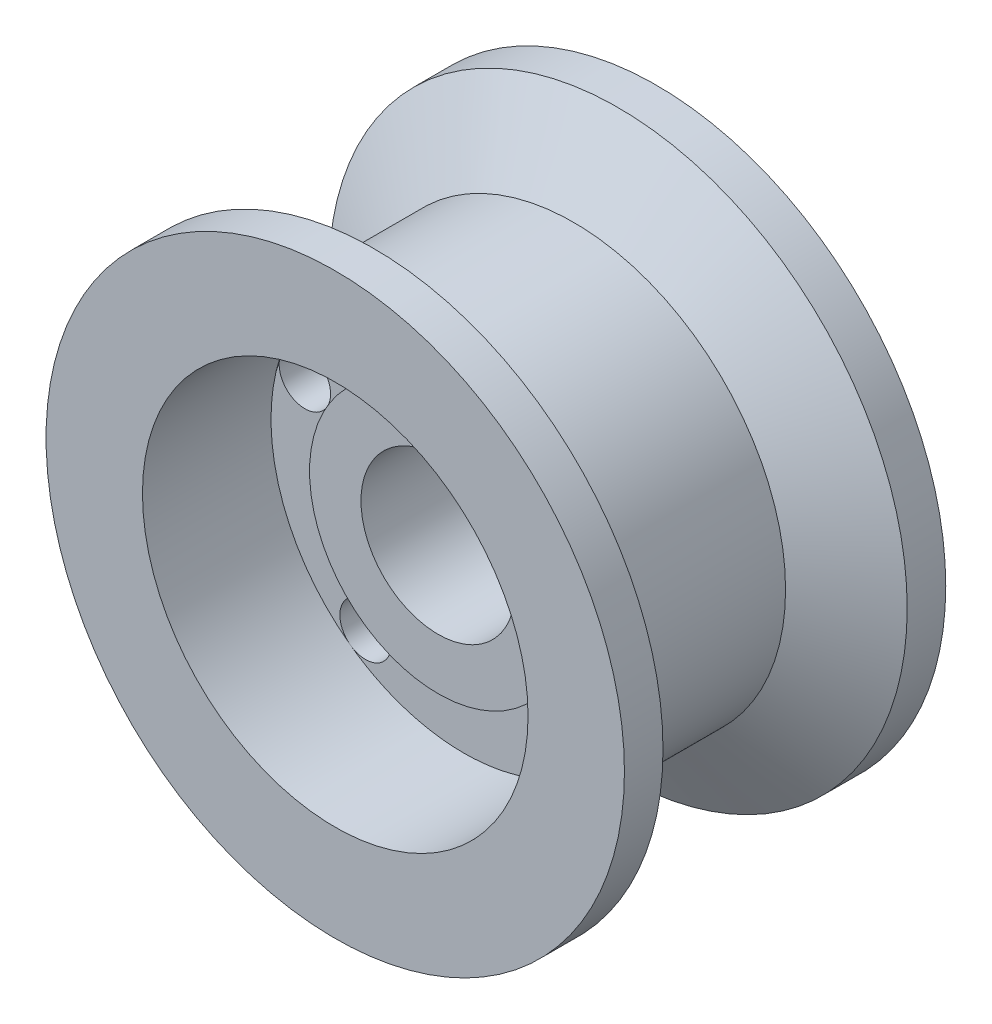
ISO-10303-21;
HEADER;
FILE_DESCRIPTION(('STEP AP214'),'2;1');
FILE_NAME('part.step','',(''),(''),'','','');
FILE_SCHEMA(('AUTOMOTIVE_DESIGN { 1 0 10303 214 1 1 1 1 }'));
ENDSEC;
DATA;
#1=APPLICATION_CONTEXT('core data for automotive mechanical design processes');
#2=APPLICATION_PROTOCOL_DEFINITION('international standard','automotive_design',2000,#1);
#3=PRODUCT_CONTEXT('',#1,'mechanical');
#4=PRODUCT('Part','Part','',(#3));
#5=PRODUCT_RELATED_PRODUCT_CATEGORY('part','',(#4));
#6=PRODUCT_DEFINITION_FORMATION('','',#4);
#7=PRODUCT_DEFINITION_CONTEXT('part definition',#1,'design');
#8=PRODUCT_DEFINITION('design','',#6,#7);
#9=PRODUCT_DEFINITION_SHAPE('','',#8);
#10=(LENGTH_UNIT() NAMED_UNIT(*) SI_UNIT(.MILLI.,.METRE.));
#11=(NAMED_UNIT(*) PLANE_ANGLE_UNIT() SI_UNIT($,.RADIAN.));
#12=(NAMED_UNIT(*) SI_UNIT($,.STERADIAN.) SOLID_ANGLE_UNIT());
#13=UNCERTAINTY_MEASURE_WITH_UNIT(LENGTH_MEASURE(1.E-05),#10,'distance_accuracy_value','');
#14=(GEOMETRIC_REPRESENTATION_CONTEXT(3) GLOBAL_UNCERTAINTY_ASSIGNED_CONTEXT((#13)) GLOBAL_UNIT_ASSIGNED_CONTEXT((#10,
#11,#12)) REPRESENTATION_CONTEXT('',''));
#15=CARTESIAN_POINT('',(0.,0.,0.));
#16=DIRECTION('',(0.,0.,1.));
#17=DIRECTION('',(1.,0.,0.));
#18=AXIS2_PLACEMENT_3D('',#15,#16,#17);
#19=CARTESIAN_POINT('',(0.,0.,12.5));
#20=DIRECTION('',(0.,0.,-1.));
#21=DIRECTION('',(-1.,0.,0.));
#22=AXIS2_PLACEMENT_3D('',#19,#20,#21);
#23=CYLINDRICAL_SURFACE('',#22,22.5);
#24=CARTESIAN_POINT('',(0.,0.,-9.5));
#25=DIRECTION('',(0.,0.,1.));
#26=DIRECTION('',(1.,0.,0.));
#27=AXIS2_PLACEMENT_3D('',#24,#25,#26);
#28=CIRCLE('',#27,22.5);
#29=CARTESIAN_POINT('',(22.5,0.,-9.5));
#30=VERTEX_POINT('',#29);
#31=EDGE_CURVE('E167',#30,#30,#28,.T.);
#32=ORIENTED_EDGE('',*,*,#31,.F.);
#33=EDGE_LOOP('',(#32));
#34=FACE_BOUND('',#33,.T.);
#35=CARTESIAN_POINT('',(0.,0.,-12.5));
#36=DIRECTION('',(0.,0.,1.));
#37=DIRECTION('',(1.,0.,0.));
#38=AXIS2_PLACEMENT_3D('',#35,#36,#37);
#39=CIRCLE('',#38,22.5);
#40=CARTESIAN_POINT('',(22.5,0.,-12.5));
#41=VERTEX_POINT('',#40);
#42=EDGE_CURVE('E44',#41,#41,#39,.T.);
#43=ORIENTED_EDGE('',*,*,#42,.T.);
#44=EDGE_LOOP('',(#43));
#45=FACE_BOUND('',#44,.T.);
#46=ADVANCED_FACE('F40',(#34,#45),#23,.T.);
#47=CARTESIAN_POINT('',(0.,0.,9.5));
#48=DIRECTION('',(0.,0.,1.));
#49=DIRECTION('',(1.,0.,0.));
#50=AXIS2_PLACEMENT_3D('',#47,#48,#49);
#51=CIRCLE('',#50,22.5);
#52=CARTESIAN_POINT('',(22.5,0.,9.5));
#53=VERTEX_POINT('',#52);
#54=EDGE_CURVE('E205',#53,#53,#51,.T.);
#55=ORIENTED_EDGE('',*,*,#54,.T.);
#56=EDGE_LOOP('',(#55));
#57=FACE_BOUND('',#56,.T.);
#58=CARTESIAN_POINT('',(0.,0.,12.5));
#59=DIRECTION('',(0.,0.,1.));
#60=DIRECTION('',(1.,0.,0.));
#61=AXIS2_PLACEMENT_3D('',#58,#59,#60);
#62=CIRCLE('',#61,22.5);
#63=CARTESIAN_POINT('',(22.5,0.,12.5));
#64=VERTEX_POINT('',#63);
#65=EDGE_CURVE('E11',#64,#64,#62,.T.);
#66=ORIENTED_EDGE('',*,*,#65,.F.);
#67=EDGE_LOOP('',(#66));
#68=FACE_BOUND('',#67,.T.);
#69=ADVANCED_FACE('F42',(#57,#68),#23,.T.);
#70=CARTESIAN_POINT('',(0.,0.,12.5));
#71=DIRECTION('',(0.,0.,1.));
#72=DIRECTION('',(1.,0.,0.));
#73=AXIS2_PLACEMENT_3D('',#70,#71,#72);
#74=PLANE('',#73);
#75=CARTESIAN_POINT('',(0.,0.,12.5));
#76=DIRECTION('',(0.,0.,1.));
#77=DIRECTION('',(1.,0.,0.));
#78=AXIS2_PLACEMENT_3D('',#75,#76,#77);
#79=CIRCLE('',#78,15.);
#80=CARTESIAN_POINT('',(15.,0.,12.5));
#81=VERTEX_POINT('',#80);
#82=EDGE_CURVE('E113',#81,#81,#79,.T.);
#83=ORIENTED_EDGE('',*,*,#82,.F.);
#84=EDGE_LOOP('',(#83));
#85=FACE_BOUND('',#84,.T.);
#86=ORIENTED_EDGE('',*,*,#65,.T.);
#87=EDGE_LOOP('',(#86));
#88=FACE_BOUND('',#87,.T.);
#89=ADVANCED_FACE('F162',(#85,#88),#74,.T.);
#90=CARTESIAN_POINT('',(0.,0.,-12.5));
#91=DIRECTION('',(0.,0.,1.));
#92=DIRECTION('',(1.,0.,0.));
#93=AXIS2_PLACEMENT_3D('',#90,#91,#92);
#94=PLANE('',#93);
#95=CARTESIAN_POINT('',(0.,0.,-12.5));
#96=DIRECTION('',(0.,0.,1.));
#97=DIRECTION('',(1.,0.,0.));
#98=AXIS2_PLACEMENT_3D('',#95,#96,#97);
#99=CIRCLE('',#98,15.);
#100=CARTESIAN_POINT('',(15.,0.,-12.5));
#101=VERTEX_POINT('',#100);
#102=EDGE_CURVE('E99',#101,#101,#99,.T.);
#103=ORIENTED_EDGE('',*,*,#102,.T.);
#104=EDGE_LOOP('',(#103));
#105=FACE_BOUND('',#104,.T.);
#106=ORIENTED_EDGE('',*,*,#42,.F.);
#107=EDGE_LOOP('',(#106));
#108=FACE_BOUND('',#107,.T.);
#109=ADVANCED_FACE('F171',(#105,#108),#94,.F.);
#110=CARTESIAN_POINT('',(0.,0.,2.5));
#111=DIRECTION('',(0.,0.,1.));
#112=DIRECTION('',(1.,0.,0.));
#113=AXIS2_PLACEMENT_3D('',#110,#111,#112);
#114=PLANE('',#113);
#115=CARTESIAN_POINT('',(0.,0.,2.5));
#116=DIRECTION('',(0.,0.,1.));
#117=DIRECTION('',(1.,0.,0.));
#118=AXIS2_PLACEMENT_3D('',#115,#116,#117);
#119=CIRCLE('',#118,15.);
#120=CARTESIAN_POINT('',(0.,15.,2.5));
#121=VERTEX_POINT('',#120);
#122=CARTESIAN_POINT('',(-14.2658477444273,4.63525491562417,2.5));
#123=VERTEX_POINT('',#122);
#124=EDGE_CURVE('E116',#121,#123,#119,.T.);
#125=ORIENTED_EDGE('',*,*,#124,.T.);
#126=CARTESIAN_POINT('',(-12.363734711837,4.01722092687428,2.5));
#127=DIRECTION('',(0.,0.,1.));
#128=DIRECTION('',(0.309016994374945,0.951056516295155,0.));
#129=AXIS2_PLACEMENT_3D('',#126,#127,#128);
#130=CIRCLE('',#129,2.);
#131=EDGE_CURVE('E140',#123,#123,#130,.T.);
#132=ORIENTED_EDGE('',*,*,#131,.F.);
#133=CARTESIAN_POINT('',(-8.81677878438703,-12.1352549156243,2.5));
#134=VERTEX_POINT('',#133);
#135=EDGE_CURVE('E119',#123,#134,#119,.T.);
#136=ORIENTED_EDGE('',*,*,#135,.T.);
#137=CARTESIAN_POINT('',(-7.64120827980209,-10.5172209268744,2.5));
#138=DIRECTION('',(0.,0.,1.));
#139=DIRECTION('',(-0.809016994374951,0.587785252292469,0.));
#140=AXIS2_PLACEMENT_3D('',#137,#138,#139);
#141=CIRCLE('',#140,2.);
#142=EDGE_CURVE('E139',#134,#134,#141,.T.);
#143=ORIENTED_EDGE('',*,*,#142,.F.);
#144=CARTESIAN_POINT('',(8.8167787843872,-12.1352549156241,2.5));
#145=VERTEX_POINT('',#144);
#146=EDGE_CURVE('E129',#134,#145,#119,.T.);
#147=ORIENTED_EDGE('',*,*,#146,.T.);
#148=CARTESIAN_POINT('',(7.64120827980224,-10.5172209268742,2.5));
#149=DIRECTION('',(0.,0.,1.));
#150=DIRECTION('',(-0.809016994374942,-0.58778525229248,0.));
#151=AXIS2_PLACEMENT_3D('',#148,#149,#150);
#152=CIRCLE('',#151,2.);
#153=EDGE_CURVE('E58',#145,#145,#152,.T.);
#154=ORIENTED_EDGE('',*,*,#153,.F.);
#155=CARTESIAN_POINT('',(14.2658477444273,4.63525491562437,2.5));
#156=VERTEX_POINT('',#155);
#157=EDGE_CURVE('E124',#145,#156,#119,.T.);
#158=ORIENTED_EDGE('',*,*,#157,.T.);
#159=CARTESIAN_POINT('',(12.3637347118369,4.01722092687446,2.5));
#160=DIRECTION('',(0.,0.,1.));
#161=DIRECTION('',(0.309016994374958,-0.95105651629515,0.));
#162=AXIS2_PLACEMENT_3D('',#159,#160,#161);
#163=CIRCLE('',#162,2.);
#164=EDGE_CURVE('E53',#156,#156,#163,.T.);
#165=ORIENTED_EDGE('',*,*,#164,.F.);
#166=EDGE_CURVE('E120',#156,#121,#119,.T.);
#167=ORIENTED_EDGE('',*,*,#166,.T.);
#168=CARTESIAN_POINT('',(0.,13.,2.5));
#169=DIRECTION('',(0.,0.,1.));
#170=DIRECTION('',(1.,0.,0.));
#171=AXIS2_PLACEMENT_3D('',#168,#169,#170);
#172=CIRCLE('',#171,2.);
#173=EDGE_CURVE('E105',#121,#121,#172,.T.);
#174=ORIENTED_EDGE('',*,*,#173,.F.);
#175=EDGE_LOOP('',(#125,#132,#136,#143,#147,#154,#158,#165,#167,#174));
#176=FACE_BOUND('',#175,.T.);
#177=CARTESIAN_POINT('',(0.,0.,2.5));
#178=DIRECTION('',(0.,0.,1.));
#179=DIRECTION('',(1.,0.,0.));
#180=AXIS2_PLACEMENT_3D('',#177,#178,#179);
#181=CIRCLE('',#180,10.);
#182=CARTESIAN_POINT('',(10.,0.,2.5));
#183=VERTEX_POINT('',#182);
#184=EDGE_CURVE('E194',#183,#183,#181,.T.);
#185=ORIENTED_EDGE('',*,*,#184,.F.);
#186=EDGE_LOOP('',(#185));
#187=FACE_BOUND('',#186,.T.);
#188=ADVANCED_FACE('F137',(#176,#187),#114,.T.);
#189=CARTESIAN_POINT('',(0.,0.,2.5));
#190=DIRECTION('',(0.,0.,1.));
#191=DIRECTION('',(1.,0.,0.));
#192=AXIS2_PLACEMENT_3D('',#189,#190,#191);
#193=CYLINDRICAL_SURFACE('',#192,15.);
#194=ORIENTED_EDGE('',*,*,#124,.F.);
#195=ORIENTED_EDGE('',*,*,#166,.F.);
#196=ORIENTED_EDGE('',*,*,#157,.F.);
#197=ORIENTED_EDGE('',*,*,#146,.F.);
#198=ORIENTED_EDGE('',*,*,#135,.F.);
#199=EDGE_LOOP('',(#194,#195,#196,#197,#198));
#200=FACE_BOUND('',#199,.T.);
#201=ORIENTED_EDGE('',*,*,#82,.T.);
#202=EDGE_LOOP('',(#201));
#203=FACE_BOUND('',#202,.T.);
#204=ADVANCED_FACE('F143',(#200,#203),#193,.F.);
#205=CARTESIAN_POINT('',(0.,0.,-2.5));
#206=DIRECTION('',(0.,0.,-1.));
#207=DIRECTION('',(1.,0.,0.));
#208=AXIS2_PLACEMENT_3D('',#205,#206,#207);
#209=PLANE('',#208);
#210=CARTESIAN_POINT('',(0.,0.,-2.5));
#211=DIRECTION('',(0.,0.,1.));
#212=DIRECTION('',(1.,0.,0.));
#213=AXIS2_PLACEMENT_3D('',#210,#211,#212);
#214=CIRCLE('',#213,15.);
#215=CARTESIAN_POINT('',(-14.2658477444273,4.63525491562417,-2.5));
#216=VERTEX_POINT('',#215);
#217=CARTESIAN_POINT('',(-8.81677878438703,-12.1352549156243,-2.5));
#218=VERTEX_POINT('',#217);
#219=EDGE_CURVE('E114',#216,#218,#214,.T.);
#220=ORIENTED_EDGE('',*,*,#219,.F.);
#221=CARTESIAN_POINT('',(-12.363734711837,4.01722092687428,-2.5));
#222=DIRECTION('',(0.,0.,-1.));
#223=DIRECTION('',(-1.,0.,0.));
#224=AXIS2_PLACEMENT_3D('',#221,#222,#223);
#225=CIRCLE('',#224,2.);
#226=EDGE_CURVE('E110',#216,#216,#225,.T.);
#227=ORIENTED_EDGE('',*,*,#226,.F.);
#228=CARTESIAN_POINT('',(0.,15.,-2.5));
#229=VERTEX_POINT('',#228);
#230=EDGE_CURVE('E92',#229,#216,#214,.T.);
#231=ORIENTED_EDGE('',*,*,#230,.F.);
#232=CARTESIAN_POINT('',(0.,13.,-2.5));
#233=DIRECTION('',(0.,0.,-1.));
#234=DIRECTION('',(-1.,0.,0.));
#235=AXIS2_PLACEMENT_3D('',#232,#233,#234);
#236=CIRCLE('',#235,2.);
#237=EDGE_CURVE('E102',#229,#229,#236,.T.);
#238=ORIENTED_EDGE('',*,*,#237,.F.);
#239=CARTESIAN_POINT('',(14.2658477444273,4.63525491562437,-2.5));
#240=VERTEX_POINT('',#239);
#241=EDGE_CURVE('E86',#240,#229,#214,.T.);
#242=ORIENTED_EDGE('',*,*,#241,.F.);
#243=CARTESIAN_POINT('',(12.3637347118369,4.01722092687446,-2.5));
#244=DIRECTION('',(0.,0.,-1.));
#245=DIRECTION('',(-1.,0.,0.));
#246=AXIS2_PLACEMENT_3D('',#243,#244,#245);
#247=CIRCLE('',#246,2.);
#248=EDGE_CURVE('E215',#240,#240,#247,.T.);
#249=ORIENTED_EDGE('',*,*,#248,.F.);
#250=CARTESIAN_POINT('',(8.81677878438721,-12.1352549156241,-2.5));
#251=VERTEX_POINT('',#250);
#252=EDGE_CURVE('E95',#251,#240,#214,.T.);
#253=ORIENTED_EDGE('',*,*,#252,.F.);
#254=CARTESIAN_POINT('',(7.64120827980224,-10.5172209268742,-2.5));
#255=DIRECTION('',(0.,0.,-1.));
#256=DIRECTION('',(-1.,0.,0.));
#257=AXIS2_PLACEMENT_3D('',#254,#255,#256);
#258=CIRCLE('',#257,2.);
#259=EDGE_CURVE('E220',#251,#251,#258,.T.);
#260=ORIENTED_EDGE('',*,*,#259,.F.);
#261=EDGE_CURVE('E247',#218,#251,#214,.T.);
#262=ORIENTED_EDGE('',*,*,#261,.F.);
#263=CARTESIAN_POINT('',(-7.64120827980209,-10.5172209268744,-2.5));
#264=DIRECTION('',(0.,0.,-1.));
#265=DIRECTION('',(-1.,0.,0.));
#266=AXIS2_PLACEMENT_3D('',#263,#264,#265);
#267=CIRCLE('',#266,2.);
#268=EDGE_CURVE('E222',#218,#218,#267,.T.);
#269=ORIENTED_EDGE('',*,*,#268,.F.);
#270=EDGE_LOOP('',(#220,#227,#231,#238,#242,#249,#253,#260,#262,#269));
#271=FACE_BOUND('',#270,.T.);
#272=CARTESIAN_POINT('',(0.,0.,-2.5));
#273=DIRECTION('',(0.,0.,-1.));
#274=DIRECTION('',(-1.,0.,0.));
#275=AXIS2_PLACEMENT_3D('',#272,#273,#274);
#276=CIRCLE('',#275,10.);
#277=CARTESIAN_POINT('',(-10.,0.,-2.5));
#278=VERTEX_POINT('',#277);
#279=EDGE_CURVE('E192',#278,#278,#276,.T.);
#280=ORIENTED_EDGE('',*,*,#279,.F.);
#281=EDGE_LOOP('',(#280));
#282=FACE_BOUND('',#281,.T.);
#283=ADVANCED_FACE('F154',(#271,#282),#209,.T.);
#284=CARTESIAN_POINT('',(0.,0.,-2.5));
#285=DIRECTION('',(0.,0.,-1.));
#286=DIRECTION('',(-1.,0.,0.));
#287=AXIS2_PLACEMENT_3D('',#284,#285,#286);
#288=CYLINDRICAL_SURFACE('',#287,15.);
#289=ORIENTED_EDGE('',*,*,#230,.T.);
#290=ORIENTED_EDGE('',*,*,#219,.T.);
#291=ORIENTED_EDGE('',*,*,#261,.T.);
#292=ORIENTED_EDGE('',*,*,#252,.T.);
#293=ORIENTED_EDGE('',*,*,#241,.T.);
#294=EDGE_LOOP('',(#289,#290,#291,#292,#293));
#295=FACE_BOUND('',#294,.T.);
#296=ORIENTED_EDGE('',*,*,#102,.F.);
#297=EDGE_LOOP('',(#296));
#298=FACE_BOUND('',#297,.T.);
#299=ADVANCED_FACE('F88',(#295,#298),#288,.F.);
#300=CARTESIAN_POINT('',(0.,13.,-12.5));
#301=DIRECTION('',(0.,0.,1.));
#302=DIRECTION('',(1.,0.,0.));
#303=AXIS2_PLACEMENT_3D('',#300,#301,#302);
#304=CYLINDRICAL_SURFACE('',#303,2.);
#305=ORIENTED_EDGE('',*,*,#237,.T.);
#306=EDGE_LOOP('',(#305));
#307=FACE_BOUND('',#306,.T.);
#308=ORIENTED_EDGE('',*,*,#173,.T.);
#309=EDGE_LOOP('',(#308));
#310=FACE_BOUND('',#309,.T.);
#311=ADVANCED_FACE('F103',(#307,#310),#304,.F.);
#312=CARTESIAN_POINT('',(12.3637347118369,4.01722092687446,-12.5));
#313=DIRECTION('',(0.,0.,1.));
#314=DIRECTION('',(1.,0.,0.));
#315=AXIS2_PLACEMENT_3D('',#312,#313,#314);
#316=CYLINDRICAL_SURFACE('',#315,2.);
#317=ORIENTED_EDGE('',*,*,#248,.T.);
#318=EDGE_LOOP('',(#317));
#319=FACE_BOUND('',#318,.T.);
#320=ORIENTED_EDGE('',*,*,#164,.T.);
#321=EDGE_LOOP('',(#320));
#322=FACE_BOUND('',#321,.T.);
#323=ADVANCED_FACE('F145',(#319,#322),#316,.F.);
#324=CARTESIAN_POINT('',(7.64120827980224,-10.5172209268742,-12.5));
#325=DIRECTION('',(0.,0.,1.));
#326=DIRECTION('',(1.,0.,0.));
#327=AXIS2_PLACEMENT_3D('',#324,#325,#326);
#328=CYLINDRICAL_SURFACE('',#327,2.);
#329=ORIENTED_EDGE('',*,*,#259,.T.);
#330=EDGE_LOOP('',(#329));
#331=FACE_BOUND('',#330,.T.);
#332=ORIENTED_EDGE('',*,*,#153,.T.);
#333=EDGE_LOOP('',(#332));
#334=FACE_BOUND('',#333,.T.);
#335=ADVANCED_FACE('F151',(#331,#334),#328,.F.);
#336=CARTESIAN_POINT('',(-7.64120827980209,-10.5172209268744,-12.5));
#337=DIRECTION('',(0.,0.,1.));
#338=DIRECTION('',(1.,0.,0.));
#339=AXIS2_PLACEMENT_3D('',#336,#337,#338);
#340=CYLINDRICAL_SURFACE('',#339,2.);
#341=ORIENTED_EDGE('',*,*,#268,.T.);
#342=EDGE_LOOP('',(#341));
#343=FACE_BOUND('',#342,.T.);
#344=ORIENTED_EDGE('',*,*,#142,.T.);
#345=EDGE_LOOP('',(#344));
#346=FACE_BOUND('',#345,.T.);
#347=ADVANCED_FACE('F228',(#343,#346),#340,.F.);
#348=CARTESIAN_POINT('',(-12.363734711837,4.01722092687428,-12.5));
#349=DIRECTION('',(0.,0.,1.));
#350=DIRECTION('',(1.,0.,0.));
#351=AXIS2_PLACEMENT_3D('',#348,#349,#350);
#352=CYLINDRICAL_SURFACE('',#351,2.);
#353=ORIENTED_EDGE('',*,*,#226,.T.);
#354=EDGE_LOOP('',(#353));
#355=FACE_BOUND('',#354,.T.);
#356=ORIENTED_EDGE('',*,*,#131,.T.);
#357=EDGE_LOOP('',(#356));
#358=FACE_BOUND('',#357,.T.);
#359=ADVANCED_FACE('F224',(#355,#358),#352,.F.);
#360=CARTESIAN_POINT('',(0.,0.,-9.5));
#361=DIRECTION('',(0.,0.,-1.));
#362=DIRECTION('',(-1.,0.,0.));
#363=AXIS2_PLACEMENT_3D('',#360,#361,#362);
#364=CONICAL_SURFACE('',#363,22.5,1.0471975511966);
#365=CARTESIAN_POINT('',(0.,0.,-6.03589838486227));
#366=DIRECTION('',(0.,0.,1.));
#367=DIRECTION('',(1.,0.,0.));
#368=AXIS2_PLACEMENT_3D('',#365,#366,#367);
#369=CIRCLE('',#368,16.5);
#370=CARTESIAN_POINT('',(16.5,0.,-6.03589838486227));
#371=VERTEX_POINT('',#370);
#372=EDGE_CURVE('E211',#371,#371,#369,.T.);
#373=ORIENTED_EDGE('',*,*,#372,.F.);
#374=EDGE_LOOP('',(#373));
#375=FACE_BOUND('',#374,.T.);
#376=ORIENTED_EDGE('',*,*,#31,.T.);
#377=EDGE_LOOP('',(#376));
#378=FACE_BOUND('',#377,.T.);
#379=ADVANCED_FACE('F227',(#375,#378),#364,.T.);
#380=CARTESIAN_POINT('',(0.,0.,18.220139873902));
#381=DIRECTION('',(0.,0.,1.));
#382=DIRECTION('',(1.,0.,0.));
#383=AXIS2_PLACEMENT_3D('',#380,#381,#382);
#384=CYLINDRICAL_SURFACE('',#383,16.5);
#385=CARTESIAN_POINT('',(0.,0.,6.03589838486227));
#386=DIRECTION('',(0.,0.,1.));
#387=DIRECTION('',(1.,0.,0.));
#388=AXIS2_PLACEMENT_3D('',#385,#386,#387);
#389=CIRCLE('',#388,16.5);
#390=CARTESIAN_POINT('',(16.5,0.,6.03589838486227));
#391=VERTEX_POINT('',#390);
#392=EDGE_CURVE('E208',#391,#391,#389,.T.);
#393=ORIENTED_EDGE('',*,*,#392,.F.);
#394=EDGE_LOOP('',(#393));
#395=FACE_BOUND('',#394,.T.);
#396=ORIENTED_EDGE('',*,*,#372,.T.);
#397=EDGE_LOOP('',(#396));
#398=FACE_BOUND('',#397,.T.);
#399=ADVANCED_FACE('F234',(#395,#398),#384,.T.);
#400=CARTESIAN_POINT('',(0.,0.,6.03589838486227));
#401=DIRECTION('',(0.,0.,1.));
#402=DIRECTION('',(1.,0.,0.));
#403=AXIS2_PLACEMENT_3D('',#400,#401,#402);
#404=CONICAL_SURFACE('',#403,16.5,1.0471975511966);
#405=ORIENTED_EDGE('',*,*,#54,.F.);
#406=EDGE_LOOP('',(#405));
#407=FACE_BOUND('',#406,.T.);
#408=ORIENTED_EDGE('',*,*,#392,.T.);
#409=EDGE_LOOP('',(#408));
#410=FACE_BOUND('',#409,.T.);
#411=ADVANCED_FACE('F276',(#407,#410),#404,.T.);
#412=CARTESIAN_POINT('',(0.,0.,-4.5));
#413=DIRECTION('',(0.,0.,1.));
#414=DIRECTION('',(1.,0.,0.));
#415=AXIS2_PLACEMENT_3D('',#412,#413,#414);
#416=CYLINDRICAL_SURFACE('',#415,10.);
#417=ORIENTED_EDGE('',*,*,#184,.T.);
#418=EDGE_LOOP('',(#417));
#419=FACE_BOUND('',#418,.T.);
#420=CARTESIAN_POINT('',(0.,0.,4.5));
#421=DIRECTION('',(0.,0.,1.));
#422=DIRECTION('',(1.,0.,0.));
#423=AXIS2_PLACEMENT_3D('',#420,#421,#422);
#424=CIRCLE('',#423,10.);
#425=CARTESIAN_POINT('',(10.,0.,4.5));
#426=VERTEX_POINT('',#425);
#427=EDGE_CURVE('E474',#426,#426,#424,.T.);
#428=ORIENTED_EDGE('',*,*,#427,.F.);
#429=EDGE_LOOP('',(#428));
#430=FACE_BOUND('',#429,.T.);
#431=ADVANCED_FACE('F285',(#419,#430),#416,.T.);
#432=ORIENTED_EDGE('',*,*,#279,.T.);
#433=EDGE_LOOP('',(#432));
#434=FACE_BOUND('',#433,.T.);
#435=CARTESIAN_POINT('',(0.,0.,-4.5));
#436=DIRECTION('',(0.,0.,1.));
#437=DIRECTION('',(1.,0.,0.));
#438=AXIS2_PLACEMENT_3D('',#435,#436,#437);
#439=CIRCLE('',#438,10.);
#440=CARTESIAN_POINT('',(10.,0.,-4.5));
#441=VERTEX_POINT('',#440);
#442=EDGE_CURVE('E195',#441,#441,#439,.T.);
#443=ORIENTED_EDGE('',*,*,#442,.T.);
#444=EDGE_LOOP('',(#443));
#445=FACE_BOUND('',#444,.T.);
#446=ADVANCED_FACE('F295',(#434,#445),#416,.T.);
#447=CARTESIAN_POINT('',(0.,0.,-4.5));
#448=DIRECTION('',(0.,0.,1.));
#449=DIRECTION('',(1.,0.,0.));
#450=AXIS2_PLACEMENT_3D('',#447,#448,#449);
#451=PLANE('',#450);
#452=CARTESIAN_POINT('',(0.,0.,-4.5));
#453=DIRECTION('',(0.,0.,1.));
#454=DIRECTION('',(1.,0.,0.));
#455=AXIS2_PLACEMENT_3D('',#452,#453,#454);
#456=CIRCLE('',#455,6.);
#457=CARTESIAN_POINT('',(6.,0.,-4.5));
#458=VERTEX_POINT('',#457);
#459=EDGE_CURVE('E200',#458,#458,#456,.T.);
#460=ORIENTED_EDGE('',*,*,#459,.T.);
#461=EDGE_LOOP('',(#460));
#462=FACE_BOUND('',#461,.T.);
#463=ORIENTED_EDGE('',*,*,#442,.F.);
#464=EDGE_LOOP('',(#463));
#465=FACE_BOUND('',#464,.T.);
#466=ADVANCED_FACE('F305',(#462,#465),#451,.F.);
#467=CARTESIAN_POINT('',(0.,0.,-4.5));
#468=DIRECTION('',(0.,0.,1.));
#469=DIRECTION('',(1.,0.,0.));
#470=AXIS2_PLACEMENT_3D('',#467,#468,#469);
#471=CYLINDRICAL_SURFACE('',#470,6.);
#472=ORIENTED_EDGE('',*,*,#459,.F.);
#473=EDGE_LOOP('',(#472));
#474=FACE_BOUND('',#473,.T.);
#475=CARTESIAN_POINT('',(0.,0.,4.5));
#476=DIRECTION('',(0.,0.,1.));
#477=DIRECTION('',(1.,0.,0.));
#478=AXIS2_PLACEMENT_3D('',#475,#476,#477);
#479=CIRCLE('',#478,6.);
#480=CARTESIAN_POINT('',(6.,0.,4.5));
#481=VERTEX_POINT('',#480);
#482=EDGE_CURVE('E477',#481,#481,#479,.T.);
#483=ORIENTED_EDGE('',*,*,#482,.T.);
#484=EDGE_LOOP('',(#483));
#485=FACE_BOUND('',#484,.T.);
#486=ADVANCED_FACE('F313',(#474,#485),#471,.F.);
#487=CARTESIAN_POINT('',(0.,0.,4.5));
#488=DIRECTION('',(0.,0.,1.));
#489=DIRECTION('',(1.,0.,0.));
#490=AXIS2_PLACEMENT_3D('',#487,#488,#489);
#491=PLANE('',#490);
#492=ORIENTED_EDGE('',*,*,#427,.T.);
#493=EDGE_LOOP('',(#492));
#494=FACE_BOUND('',#493,.T.);
#495=ORIENTED_EDGE('',*,*,#482,.F.);
#496=EDGE_LOOP('',(#495));
#497=FACE_BOUND('',#496,.T.);
#498=ADVANCED_FACE('F323',(#494,#497),#491,.T.);
#499=CLOSED_SHELL('',(#46,#69,#89,#109,#188,#204,#283,#299,#311,#323,#335,#347,#359,#379,#399,
#411,#431,#446,#466,#486,#498));
#500=MANIFOLD_SOLID_BREP('B2',#499);
#501=ADVANCED_BREP_SHAPE_REPRESENTATION('',(#18,#500),#14);
#502=SHAPE_DEFINITION_REPRESENTATION(#9,#501);
ENDSEC;
END-ISO-10303-21;
